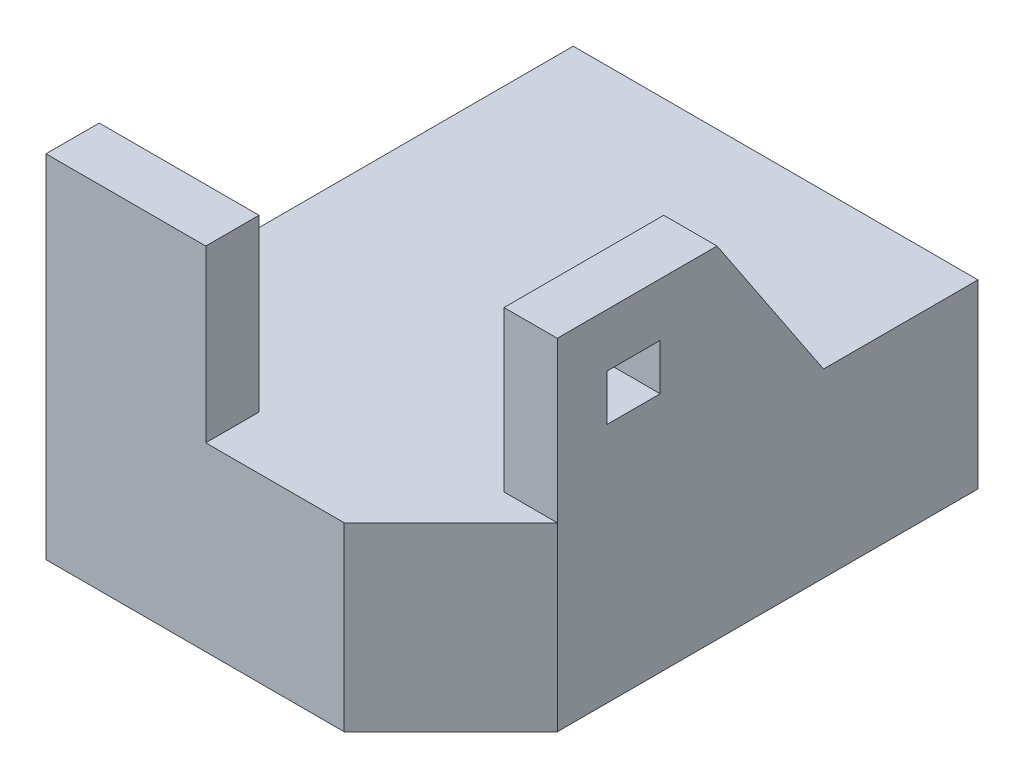
ISO-10303-21;
HEADER;
FILE_DESCRIPTION(('STEP AP214'),'2;1');
FILE_NAME('part.step','',(''),(''),'','','');
FILE_SCHEMA(('AUTOMOTIVE_DESIGN { 1 0 10303 214 1 1 1 1 }'));
ENDSEC;
DATA;
#1=APPLICATION_CONTEXT('core data for automotive mechanical design processes');
#2=APPLICATION_PROTOCOL_DEFINITION('international standard','automotive_design',2000,#1);
#3=PRODUCT_CONTEXT('',#1,'mechanical');
#4=PRODUCT('Part','Part','',(#3));
#5=PRODUCT_RELATED_PRODUCT_CATEGORY('part','',(#4));
#6=PRODUCT_DEFINITION_FORMATION('','',#4);
#7=PRODUCT_DEFINITION_CONTEXT('part definition',#1,'design');
#8=PRODUCT_DEFINITION('design','',#6,#7);
#9=PRODUCT_DEFINITION_SHAPE('','',#8);
#10=(LENGTH_UNIT() NAMED_UNIT(*) SI_UNIT(.MILLI.,.METRE.));
#11=(NAMED_UNIT(*) PLANE_ANGLE_UNIT() SI_UNIT($,.RADIAN.));
#12=(NAMED_UNIT(*) SI_UNIT($,.STERADIAN.) SOLID_ANGLE_UNIT());
#13=UNCERTAINTY_MEASURE_WITH_UNIT(LENGTH_MEASURE(1.E-05),#10,'distance_accuracy_value','');
#14=(GEOMETRIC_REPRESENTATION_CONTEXT(3) GLOBAL_UNCERTAINTY_ASSIGNED_CONTEXT((#13)) GLOBAL_UNIT_ASSIGNED_CONTEXT((#10,
#11,#12)) REPRESENTATION_CONTEXT('',''));
#15=CARTESIAN_POINT('',(0.,0.,0.));
#16=DIRECTION('',(0.,0.,1.));
#17=DIRECTION('',(1.,0.,0.));
#18=AXIS2_PLACEMENT_3D('',#15,#16,#17);
#19=CARTESIAN_POINT('',(0.,863.6,0.));
#20=DIRECTION('',(0.,-1.,0.));
#21=DIRECTION('',(0.,0.,-1.));
#22=AXIS2_PLACEMENT_3D('',#19,#20,#21);
#23=PLANE('',#22);
#24=DIRECTION('',(0.707106781186546,0.,-0.707106781186549));
#25=VECTOR('',#24,1.);
#26=CARTESIAN_POINT('',(1422.4,863.6,2514.6));
#27=LINE('',#26,#25);
#28=CARTESIAN_POINT('',(1422.4,863.6,2514.6));
#29=VERTEX_POINT('',#28);
#30=CARTESIAN_POINT('',(1930.4,863.6,2006.6));
#31=VERTEX_POINT('',#30);
#32=EDGE_CURVE('E248',#29,#31,#27,.T.);
#33=ORIENTED_EDGE('',*,*,#32,.T.);
#34=DIRECTION('',(1.,0.,0.));
#35=VECTOR('',#34,1.);
#36=CARTESIAN_POINT('',(1676.4,863.6,2006.6));
#37=LINE('',#36,#35);
#38=CARTESIAN_POINT('',(1676.4,863.6,2006.6));
#39=VERTEX_POINT('',#38);
#40=EDGE_CURVE('E204',#39,#31,#37,.T.);
#41=ORIENTED_EDGE('',*,*,#40,.F.);
#42=DIRECTION('',(0.,0.,-1.));
#43=VECTOR('',#42,1.);
#44=CARTESIAN_POINT('',(1676.4,863.6,2006.6));
#45=LINE('',#44,#43);
#46=CARTESIAN_POINT('',(1676.4,863.6,736.6));
#47=VERTEX_POINT('',#46);
#48=EDGE_CURVE('E194',#39,#47,#45,.T.);
#49=ORIENTED_EDGE('',*,*,#48,.T.);
#50=DIRECTION('',(1.,0.,0.));
#51=VECTOR('',#50,1.);
#52=CARTESIAN_POINT('',(1676.4,863.6,736.6));
#53=LINE('',#52,#51);
#54=CARTESIAN_POINT('',(1930.4,863.6,736.6));
#55=VERTEX_POINT('',#54);
#56=EDGE_CURVE('E215',#47,#55,#53,.T.);
#57=ORIENTED_EDGE('',*,*,#56,.T.);
#58=DIRECTION('',(0.,0.,1.));
#59=VECTOR('',#58,1.);
#60=CARTESIAN_POINT('',(1930.4,863.6,0.));
#61=LINE('',#60,#59);
#62=CARTESIAN_POINT('',(1930.4,863.6,0.));
#63=VERTEX_POINT('',#62);
#64=EDGE_CURVE('E244',#63,#55,#61,.T.);
#65=ORIENTED_EDGE('',*,*,#64,.F.);
#66=DIRECTION('',(1.,0.,0.));
#67=VECTOR('',#66,1.);
#68=CARTESIAN_POINT('',(0.,863.6,0.));
#69=LINE('',#68,#67);
#70=CARTESIAN_POINT('',(0.,863.6,0.));
#71=VERTEX_POINT('',#70);
#72=EDGE_CURVE('E241',#71,#63,#69,.T.);
#73=ORIENTED_EDGE('',*,*,#72,.F.);
#74=DIRECTION('',(0.,0.,1.));
#75=VECTOR('',#74,1.);
#76=CARTESIAN_POINT('',(0.,863.6,0.));
#77=LINE('',#76,#75);
#78=CARTESIAN_POINT('',(0.,863.6,2260.6));
#79=VERTEX_POINT('',#78);
#80=EDGE_CURVE('E253',#71,#79,#77,.T.);
#81=ORIENTED_EDGE('',*,*,#80,.T.);
#82=DIRECTION('',(-1.,0.,0.));
#83=VECTOR('',#82,1.);
#84=CARTESIAN_POINT('',(762.,863.6,2260.6));
#85=LINE('',#84,#83);
#86=CARTESIAN_POINT('',(762.,863.6,2260.6));
#87=VERTEX_POINT('',#86);
#88=EDGE_CURVE('E54',#87,#79,#85,.T.);
#89=ORIENTED_EDGE('',*,*,#88,.F.);
#90=DIRECTION('',(0.,0.,-1.));
#91=VECTOR('',#90,1.);
#92=CARTESIAN_POINT('',(762.,863.6,2260.6));
#93=LINE('',#92,#91);
#94=CARTESIAN_POINT('',(762.,863.6,2514.6));
#95=VERTEX_POINT('',#94);
#96=EDGE_CURVE('E59',#95,#87,#93,.T.);
#97=ORIENTED_EDGE('',*,*,#96,.F.);
#98=DIRECTION('',(1.,0.,0.));
#99=VECTOR('',#98,1.);
#100=CARTESIAN_POINT('',(0.,863.6,2514.6));
#101=LINE('',#100,#99);
#102=EDGE_CURVE('E251',#95,#29,#101,.T.);
#103=ORIENTED_EDGE('',*,*,#102,.T.);
#104=EDGE_LOOP('',(#33,#41,#49,#57,#65,#73,#81,#89,#97,#103));
#105=FACE_BOUND('',#104,.T.);
#106=ADVANCED_FACE('F37',(#105),#23,.F.);
#107=CARTESIAN_POINT('',(0.,863.6,0.));
#108=DIRECTION('',(0.,0.,-1.));
#109=DIRECTION('',(-1.,0.,0.));
#110=AXIS2_PLACEMENT_3D('',#107,#108,#109);
#111=PLANE('',#110);
#112=DIRECTION('',(1.,0.,0.));
#113=VECTOR('',#112,1.);
#114=CARTESIAN_POINT('',(0.,0.,0.));
#115=LINE('',#114,#113);
#116=CARTESIAN_POINT('',(0.,0.,0.));
#117=VERTEX_POINT('',#116);
#118=CARTESIAN_POINT('',(1930.4,0.,0.));
#119=VERTEX_POINT('',#118);
#120=EDGE_CURVE('E240',#117,#119,#115,.T.);
#121=ORIENTED_EDGE('',*,*,#120,.F.);
#122=DIRECTION('',(0.,-1.,0.));
#123=VECTOR('',#122,1.);
#124=CARTESIAN_POINT('',(0.,863.6,0.));
#125=LINE('',#124,#123);
#126=EDGE_CURVE('E11',#71,#117,#125,.T.);
#127=ORIENTED_EDGE('',*,*,#126,.F.);
#128=ORIENTED_EDGE('',*,*,#72,.T.);
#129=DIRECTION('',(0.,-1.,0.));
#130=VECTOR('',#129,1.);
#131=CARTESIAN_POINT('',(1930.4,863.6,0.));
#132=LINE('',#131,#130);
#133=EDGE_CURVE('E41',#63,#119,#132,.T.);
#134=ORIENTED_EDGE('',*,*,#133,.T.);
#135=EDGE_LOOP('',(#121,#127,#128,#134));
#136=FACE_BOUND('',#135,.T.);
#137=ADVANCED_FACE('F39',(#136),#111,.T.);
#138=CARTESIAN_POINT('',(0.,863.6,0.));
#139=DIRECTION('',(1.,0.,0.));
#140=DIRECTION('',(0.,0.,-1.));
#141=AXIS2_PLACEMENT_3D('',#138,#139,#140);
#142=PLANE('',#141);
#143=DIRECTION('',(0.,0.,1.));
#144=VECTOR('',#143,1.);
#145=CARTESIAN_POINT('',(0.,0.,0.));
#146=LINE('',#145,#144);
#147=CARTESIAN_POINT('',(0.,0.,2514.6));
#148=VERTEX_POINT('',#147);
#149=EDGE_CURVE('E245',#117,#148,#146,.T.);
#150=ORIENTED_EDGE('',*,*,#149,.T.);
#151=DIRECTION('',(0.,-1.,0.));
#152=VECTOR('',#151,1.);
#153=CARTESIAN_POINT('',(0.,863.6,2514.6));
#154=LINE('',#153,#152);
#155=CARTESIAN_POINT('',(0.,1676.4,2514.6));
#156=VERTEX_POINT('',#155);
#157=EDGE_CURVE('E46',#156,#148,#154,.T.);
#158=ORIENTED_EDGE('',*,*,#157,.F.);
#159=DIRECTION('',(0.,0.,1.));
#160=VECTOR('',#159,1.);
#161=CARTESIAN_POINT('',(0.,1676.4,2260.6));
#162=LINE('',#161,#160);
#163=CARTESIAN_POINT('',(0.,1676.4,2260.6));
#164=VERTEX_POINT('',#163);
#165=EDGE_CURVE('E225',#164,#156,#162,.T.);
#166=ORIENTED_EDGE('',*,*,#165,.F.);
#167=DIRECTION('',(0.,-1.,0.));
#168=VECTOR('',#167,1.);
#169=CARTESIAN_POINT('',(0.,1676.4,2260.6));
#170=LINE('',#169,#168);
#171=EDGE_CURVE('E235',#164,#79,#170,.T.);
#172=ORIENTED_EDGE('',*,*,#171,.T.);
#173=ORIENTED_EDGE('',*,*,#80,.F.);
#174=ORIENTED_EDGE('',*,*,#126,.T.);
#175=EDGE_LOOP('',(#150,#158,#166,#172,#173,#174));
#176=FACE_BOUND('',#175,.T.);
#177=ADVANCED_FACE('F286',(#176),#142,.F.);
#178=CARTESIAN_POINT('',(0.,863.6,2514.6));
#179=DIRECTION('',(0.,0.,-1.));
#180=DIRECTION('',(-1.,0.,0.));
#181=AXIS2_PLACEMENT_3D('',#178,#179,#180);
#182=PLANE('',#181);
#183=DIRECTION('',(1.,0.,0.));
#184=VECTOR('',#183,1.);
#185=CARTESIAN_POINT('',(0.,0.,2514.6));
#186=LINE('',#185,#184);
#187=CARTESIAN_POINT('',(1422.4,0.,2514.6));
#188=VERTEX_POINT('',#187);
#189=EDGE_CURVE('E263',#148,#188,#186,.T.);
#190=ORIENTED_EDGE('',*,*,#189,.T.);
#191=DIRECTION('',(0.,-1.,0.));
#192=VECTOR('',#191,1.);
#193=CARTESIAN_POINT('',(1422.4,863.6,2514.6));
#194=LINE('',#193,#192);
#195=EDGE_CURVE('E268',#29,#188,#194,.T.);
#196=ORIENTED_EDGE('',*,*,#195,.F.);
#197=ORIENTED_EDGE('',*,*,#102,.F.);
#198=DIRECTION('',(0.,-1.,0.));
#199=VECTOR('',#198,1.);
#200=CARTESIAN_POINT('',(762.,1676.4,2514.6));
#201=LINE('',#200,#199);
#202=CARTESIAN_POINT('',(762.,1676.4,2514.6));
#203=VERTEX_POINT('',#202);
#204=EDGE_CURVE('E230',#203,#95,#201,.T.);
#205=ORIENTED_EDGE('',*,*,#204,.F.);
#206=DIRECTION('',(1.,0.,0.));
#207=VECTOR('',#206,1.);
#208=CARTESIAN_POINT('',(762.,1676.4,2514.6));
#209=LINE('',#208,#207);
#210=EDGE_CURVE('E228',#156,#203,#209,.T.);
#211=ORIENTED_EDGE('',*,*,#210,.F.);
#212=ORIENTED_EDGE('',*,*,#157,.T.);
#213=EDGE_LOOP('',(#190,#196,#197,#205,#211,#212));
#214=FACE_BOUND('',#213,.T.);
#215=ADVANCED_FACE('F291',(#214),#182,.F.);
#216=CARTESIAN_POINT('',(1422.4,863.6,2514.6));
#217=DIRECTION('',(-0.707106781186549,0.,-0.707106781186546));
#218=DIRECTION('',(-0.707106781186546,0.,0.707106781186549));
#219=AXIS2_PLACEMENT_3D('',#216,#217,#218);
#220=PLANE('',#219);
#221=DIRECTION('',(0.707106781186546,0.,-0.707106781186549));
#222=VECTOR('',#221,1.);
#223=CARTESIAN_POINT('',(1422.4,0.,2514.6));
#224=LINE('',#223,#222);
#225=CARTESIAN_POINT('',(1930.4,0.,2006.6));
#226=VERTEX_POINT('',#225);
#227=EDGE_CURVE('E260',#188,#226,#224,.T.);
#228=ORIENTED_EDGE('',*,*,#227,.T.);
#229=DIRECTION('',(0.,-1.,0.));
#230=VECTOR('',#229,1.);
#231=CARTESIAN_POINT('',(1930.4,863.6,2006.6));
#232=LINE('',#231,#230);
#233=EDGE_CURVE('E270',#31,#226,#232,.T.);
#234=ORIENTED_EDGE('',*,*,#233,.F.);
#235=ORIENTED_EDGE('',*,*,#32,.F.);
#236=ORIENTED_EDGE('',*,*,#195,.T.);
#237=EDGE_LOOP('',(#228,#234,#235,#236));
#238=FACE_BOUND('',#237,.T.);
#239=ADVANCED_FACE('F321',(#238),#220,.F.);
#240=CARTESIAN_POINT('',(1930.4,863.6,0.));
#241=DIRECTION('',(1.,0.,0.));
#242=DIRECTION('',(0.,0.,-1.));
#243=AXIS2_PLACEMENT_3D('',#240,#241,#242);
#244=PLANE('',#243);
#245=DIRECTION('',(0.,0.,1.));
#246=VECTOR('',#245,1.);
#247=CARTESIAN_POINT('',(1930.4,0.,0.));
#248=LINE('',#247,#246);
#249=EDGE_CURVE('E257',#119,#226,#248,.T.);
#250=ORIENTED_EDGE('',*,*,#249,.F.);
#251=ORIENTED_EDGE('',*,*,#133,.F.);
#252=ORIENTED_EDGE('',*,*,#64,.T.);
#253=DIRECTION('',(0.,0.832050294337843,0.554700196225229));
#254=VECTOR('',#253,1.);
#255=CARTESIAN_POINT('',(1930.4,863.6,736.6));
#256=LINE('',#255,#254);
#257=CARTESIAN_POINT('',(1930.4,1625.6,1244.6));
#258=VERTEX_POINT('',#257);
#259=EDGE_CURVE('E206',#55,#258,#256,.T.);
#260=ORIENTED_EDGE('',*,*,#259,.T.);
#261=DIRECTION('',(0.,0.,1.));
#262=VECTOR('',#261,1.);
#263=CARTESIAN_POINT('',(1930.4,1625.6,1244.6));
#264=LINE('',#263,#262);
#265=CARTESIAN_POINT('',(1930.4,1625.6,2006.6));
#266=VERTEX_POINT('',#265);
#267=EDGE_CURVE('E195',#258,#266,#264,.T.);
#268=ORIENTED_EDGE('',*,*,#267,.T.);
#269=DIRECTION('',(0.,-1.,0.));
#270=VECTOR('',#269,1.);
#271=CARTESIAN_POINT('',(1930.4,1625.6,2006.6));
#272=LINE('',#271,#270);
#273=EDGE_CURVE('E187',#266,#31,#272,.T.);
#274=ORIENTED_EDGE('',*,*,#273,.T.);
#275=ORIENTED_EDGE('',*,*,#233,.T.);
#276=EDGE_LOOP('',(#250,#251,#252,#260,#268,#274,#275));
#277=FACE_BOUND('',#276,.T.);
#278=DIRECTION('',(0.,-1.,0.));
#279=VECTOR('',#278,1.);
#280=CARTESIAN_POINT('',(1930.4,1371.6,1769.78606773817));
#281=LINE('',#280,#279);
#282=CARTESIAN_POINT('',(1930.4,1371.6,1769.78606773817));
#283=VERTEX_POINT('',#282);
#284=CARTESIAN_POINT('',(1930.4,1150.93345170055,1769.78606773817));
#285=VERTEX_POINT('',#284);
#286=EDGE_CURVE('E154',#283,#285,#281,.T.);
#287=ORIENTED_EDGE('',*,*,#286,.F.);
#288=DIRECTION('',(0.,0.,1.));
#289=VECTOR('',#288,1.);
#290=CARTESIAN_POINT('',(1930.4,1371.6,1769.78606773817));
#291=LINE('',#290,#289);
#292=CARTESIAN_POINT('',(1930.4,1371.6,1515.78606773817));
#293=VERTEX_POINT('',#292);
#294=EDGE_CURVE('E172',#293,#283,#291,.T.);
#295=ORIENTED_EDGE('',*,*,#294,.F.);
#296=DIRECTION('',(0.,1.,0.));
#297=VECTOR('',#296,1.);
#298=CARTESIAN_POINT('',(1930.4,1371.6,1515.78606773817));
#299=LINE('',#298,#297);
#300=CARTESIAN_POINT('',(1930.4,1150.93345170055,1515.78606773817));
#301=VERTEX_POINT('',#300);
#302=EDGE_CURVE('E175',#301,#293,#299,.T.);
#303=ORIENTED_EDGE('',*,*,#302,.F.);
#304=DIRECTION('',(0.,0.,-1.));
#305=VECTOR('',#304,1.);
#306=CARTESIAN_POINT('',(1930.4,1150.93345170055,1769.78606773817));
#307=LINE('',#306,#305);
#308=EDGE_CURVE('E181',#285,#301,#307,.T.);
#309=ORIENTED_EDGE('',*,*,#308,.F.);
#310=EDGE_LOOP('',(#287,#295,#303,#309));
#311=FACE_BOUND('',#310,.T.);
#312=ADVANCED_FACE('F278',(#277,#311),#244,.T.);
#313=CARTESIAN_POINT('',(0.,0.,0.));
#314=DIRECTION('',(0.,-1.,0.));
#315=DIRECTION('',(0.,0.,-1.));
#316=AXIS2_PLACEMENT_3D('',#313,#314,#315);
#317=PLANE('',#316);
#318=ORIENTED_EDGE('',*,*,#120,.T.);
#319=ORIENTED_EDGE('',*,*,#249,.T.);
#320=ORIENTED_EDGE('',*,*,#227,.F.);
#321=ORIENTED_EDGE('',*,*,#189,.F.);
#322=ORIENTED_EDGE('',*,*,#149,.F.);
#323=EDGE_LOOP('',(#318,#319,#320,#321,#322));
#324=FACE_BOUND('',#323,.T.);
#325=ADVANCED_FACE('F283',(#324),#317,.T.);
#326=CARTESIAN_POINT('',(762.,1676.4,2260.6));
#327=DIRECTION('',(-1.,0.,0.));
#328=DIRECTION('',(0.,0.,1.));
#329=AXIS2_PLACEMENT_3D('',#326,#327,#328);
#330=PLANE('',#329);
#331=ORIENTED_EDGE('',*,*,#96,.T.);
#332=DIRECTION('',(0.,-1.,0.));
#333=VECTOR('',#332,1.);
#334=CARTESIAN_POINT('',(762.,1676.4,2260.6));
#335=LINE('',#334,#333);
#336=CARTESIAN_POINT('',(762.,1676.4,2260.6));
#337=VERTEX_POINT('',#336);
#338=EDGE_CURVE('E238',#337,#87,#335,.T.);
#339=ORIENTED_EDGE('',*,*,#338,.F.);
#340=DIRECTION('',(0.,0.,-1.));
#341=VECTOR('',#340,1.);
#342=CARTESIAN_POINT('',(762.,1676.4,2260.6));
#343=LINE('',#342,#341);
#344=EDGE_CURVE('E220',#203,#337,#343,.T.);
#345=ORIENTED_EDGE('',*,*,#344,.F.);
#346=ORIENTED_EDGE('',*,*,#204,.T.);
#347=EDGE_LOOP('',(#331,#339,#345,#346));
#348=FACE_BOUND('',#347,.T.);
#349=ADVANCED_FACE('F302',(#348),#330,.F.);
#350=CARTESIAN_POINT('',(762.,1676.4,2260.6));
#351=DIRECTION('',(0.,0.,1.));
#352=DIRECTION('',(1.,0.,0.));
#353=AXIS2_PLACEMENT_3D('',#350,#351,#352);
#354=PLANE('',#353);
#355=ORIENTED_EDGE('',*,*,#88,.T.);
#356=ORIENTED_EDGE('',*,*,#171,.F.);
#357=DIRECTION('',(-1.,0.,0.));
#358=VECTOR('',#357,1.);
#359=CARTESIAN_POINT('',(762.,1676.4,2260.6));
#360=LINE('',#359,#358);
#361=EDGE_CURVE('E223',#337,#164,#360,.T.);
#362=ORIENTED_EDGE('',*,*,#361,.F.);
#363=ORIENTED_EDGE('',*,*,#338,.T.);
#364=EDGE_LOOP('',(#355,#356,#362,#363));
#365=FACE_BOUND('',#364,.T.);
#366=ADVANCED_FACE('F300',(#365),#354,.F.);
#367=CARTESIAN_POINT('',(0.,1676.4,0.));
#368=DIRECTION('',(0.,-1.,0.));
#369=DIRECTION('',(0.,0.,-1.));
#370=AXIS2_PLACEMENT_3D('',#367,#368,#369);
#371=PLANE('',#370);
#372=ORIENTED_EDGE('',*,*,#344,.T.);
#373=ORIENTED_EDGE('',*,*,#361,.T.);
#374=ORIENTED_EDGE('',*,*,#165,.T.);
#375=ORIENTED_EDGE('',*,*,#210,.T.);
#376=EDGE_LOOP('',(#372,#373,#374,#375));
#377=FACE_BOUND('',#376,.T.);
#378=ADVANCED_FACE('F296',(#377),#371,.F.);
#379=CARTESIAN_POINT('',(1676.4,1625.6,2006.6));
#380=DIRECTION('',(0.,0.,1.));
#381=DIRECTION('',(1.,0.,0.));
#382=AXIS2_PLACEMENT_3D('',#379,#380,#381);
#383=PLANE('',#382);
#384=ORIENTED_EDGE('',*,*,#273,.F.);
#385=DIRECTION('',(1.,0.,0.));
#386=VECTOR('',#385,1.);
#387=CARTESIAN_POINT('',(1676.4,1625.6,2006.6));
#388=LINE('',#387,#386);
#389=CARTESIAN_POINT('',(1676.4,1625.6,2006.6));
#390=VERTEX_POINT('',#389);
#391=EDGE_CURVE('E211',#390,#266,#388,.T.);
#392=ORIENTED_EDGE('',*,*,#391,.F.);
#393=DIRECTION('',(0.,-1.,0.));
#394=VECTOR('',#393,1.);
#395=CARTESIAN_POINT('',(1676.4,1625.6,2006.6));
#396=LINE('',#395,#394);
#397=EDGE_CURVE('E191',#390,#39,#396,.T.);
#398=ORIENTED_EDGE('',*,*,#397,.T.);
#399=ORIENTED_EDGE('',*,*,#40,.T.);
#400=EDGE_LOOP('',(#384,#392,#398,#399));
#401=FACE_BOUND('',#400,.T.);
#402=ADVANCED_FACE('F371',(#401),#383,.T.);
#403=CARTESIAN_POINT('',(1676.4,1625.6,1244.6));
#404=DIRECTION('',(0.,1.,0.));
#405=DIRECTION('',(0.,0.,1.));
#406=AXIS2_PLACEMENT_3D('',#403,#404,#405);
#407=PLANE('',#406);
#408=ORIENTED_EDGE('',*,*,#267,.F.);
#409=DIRECTION('',(1.,0.,0.));
#410=VECTOR('',#409,1.);
#411=CARTESIAN_POINT('',(1676.4,1625.6,1244.6));
#412=LINE('',#411,#410);
#413=CARTESIAN_POINT('',(1676.4,1625.6,1244.6));
#414=VERTEX_POINT('',#413);
#415=EDGE_CURVE('E213',#414,#258,#412,.T.);
#416=ORIENTED_EDGE('',*,*,#415,.F.);
#417=DIRECTION('',(0.,0.,1.));
#418=VECTOR('',#417,1.);
#419=CARTESIAN_POINT('',(1676.4,1625.6,1244.6));
#420=LINE('',#419,#418);
#421=EDGE_CURVE('E201',#414,#390,#420,.T.);
#422=ORIENTED_EDGE('',*,*,#421,.T.);
#423=ORIENTED_EDGE('',*,*,#391,.T.);
#424=EDGE_LOOP('',(#408,#416,#422,#423));
#425=FACE_BOUND('',#424,.T.);
#426=ADVANCED_FACE('F394',(#425),#407,.T.);
#427=CARTESIAN_POINT('',(1676.4,863.6,736.6));
#428=DIRECTION('',(0.,0.554700196225229,-0.832050294337844));
#429=DIRECTION('',(0.,0.832050294337844,0.554700196225229));
#430=AXIS2_PLACEMENT_3D('',#427,#428,#429);
#431=PLANE('',#430);
#432=ORIENTED_EDGE('',*,*,#259,.F.);
#433=ORIENTED_EDGE('',*,*,#56,.F.);
#434=DIRECTION('',(0.,0.832050294337843,0.554700196225229));
#435=VECTOR('',#434,1.);
#436=CARTESIAN_POINT('',(1676.4,863.6,736.6));
#437=LINE('',#436,#435);
#438=EDGE_CURVE('E198',#47,#414,#437,.T.);
#439=ORIENTED_EDGE('',*,*,#438,.T.);
#440=ORIENTED_EDGE('',*,*,#415,.T.);
#441=EDGE_LOOP('',(#432,#433,#439,#440));
#442=FACE_BOUND('',#441,.T.);
#443=ADVANCED_FACE('F403',(#442),#431,.T.);
#444=CARTESIAN_POINT('',(1676.4,0.,-2.81293975454394E-13));
#445=DIRECTION('',(1.,0.,0.));
#446=DIRECTION('',(0.,0.,-1.));
#447=AXIS2_PLACEMENT_3D('',#444,#445,#446);
#448=PLANE('',#447);
#449=DIRECTION('',(0.,0.,1.));
#450=VECTOR('',#449,1.);
#451=CARTESIAN_POINT('',(1676.4,1371.6,1769.78606773817));
#452=LINE('',#451,#450);
#453=CARTESIAN_POINT('',(1676.4,1371.6,1515.78606773817));
#454=VERTEX_POINT('',#453);
#455=CARTESIAN_POINT('',(1676.4,1371.6,1769.78606773817));
#456=VERTEX_POINT('',#455);
#457=EDGE_CURVE('E159',#454,#456,#452,.T.);
#458=ORIENTED_EDGE('',*,*,#457,.T.);
#459=DIRECTION('',(0.,-1.,0.));
#460=VECTOR('',#459,1.);
#461=CARTESIAN_POINT('',(1676.4,1371.6,1769.78606773817));
#462=LINE('',#461,#460);
#463=CARTESIAN_POINT('',(1676.4,1150.93345170055,1769.78606773817));
#464=VERTEX_POINT('',#463);
#465=EDGE_CURVE('E151',#456,#464,#462,.T.);
#466=ORIENTED_EDGE('',*,*,#465,.T.);
#467=DIRECTION('',(0.,0.,-1.));
#468=VECTOR('',#467,1.);
#469=CARTESIAN_POINT('',(1676.4,1150.93345170055,1769.78606773817));
#470=LINE('',#469,#468);
#471=CARTESIAN_POINT('',(1676.4,1150.93345170055,1515.78606773817));
#472=VERTEX_POINT('',#471);
#473=EDGE_CURVE('E163',#464,#472,#470,.T.);
#474=ORIENTED_EDGE('',*,*,#473,.T.);
#475=DIRECTION('',(0.,1.,0.));
#476=VECTOR('',#475,1.);
#477=CARTESIAN_POINT('',(1676.4,1371.6,1515.78606773817));
#478=LINE('',#477,#476);
#479=EDGE_CURVE('E167',#472,#454,#478,.T.);
#480=ORIENTED_EDGE('',*,*,#479,.T.);
#481=EDGE_LOOP('',(#458,#466,#474,#480));
#482=FACE_BOUND('',#481,.T.);
#483=ORIENTED_EDGE('',*,*,#397,.F.);
#484=ORIENTED_EDGE('',*,*,#421,.F.);
#485=ORIENTED_EDGE('',*,*,#438,.F.);
#486=ORIENTED_EDGE('',*,*,#48,.F.);
#487=EDGE_LOOP('',(#483,#484,#485,#486));
#488=FACE_BOUND('',#487,.T.);
#489=ADVANCED_FACE('F169',(#482,#488),#448,.F.);
#490=CARTESIAN_POINT('',(1676.4,1371.6,1769.78606773817));
#491=DIRECTION('',(0.,0.,1.));
#492=DIRECTION('',(1.,0.,0.));
#493=AXIS2_PLACEMENT_3D('',#490,#491,#492);
#494=PLANE('',#493);
#495=ORIENTED_EDGE('',*,*,#286,.T.);
#496=DIRECTION('',(1.,0.,0.));
#497=VECTOR('',#496,1.);
#498=CARTESIAN_POINT('',(1676.4,1150.93345170055,1769.78606773817));
#499=LINE('',#498,#497);
#500=EDGE_CURVE('E147',#464,#285,#499,.T.);
#501=ORIENTED_EDGE('',*,*,#500,.F.);
#502=ORIENTED_EDGE('',*,*,#465,.F.);
#503=DIRECTION('',(1.,0.,0.));
#504=VECTOR('',#503,1.);
#505=CARTESIAN_POINT('',(1676.4,1371.6,1769.78606773817));
#506=LINE('',#505,#504);
#507=EDGE_CURVE('E185',#456,#283,#506,.T.);
#508=ORIENTED_EDGE('',*,*,#507,.T.);
#509=EDGE_LOOP('',(#495,#501,#502,#508));
#510=FACE_BOUND('',#509,.T.);
#511=ADVANCED_FACE('F149',(#510),#494,.F.);
#512=CARTESIAN_POINT('',(1676.4,1371.6,1769.78606773817));
#513=DIRECTION('',(0.,1.,0.));
#514=DIRECTION('',(0.,0.,1.));
#515=AXIS2_PLACEMENT_3D('',#512,#513,#514);
#516=PLANE('',#515);
#517=ORIENTED_EDGE('',*,*,#294,.T.);
#518=ORIENTED_EDGE('',*,*,#507,.F.);
#519=ORIENTED_EDGE('',*,*,#457,.F.);
#520=DIRECTION('',(1.,0.,0.));
#521=VECTOR('',#520,1.);
#522=CARTESIAN_POINT('',(1676.4,1371.6,1515.78606773817));
#523=LINE('',#522,#521);
#524=EDGE_CURVE('E188',#454,#293,#523,.T.);
#525=ORIENTED_EDGE('',*,*,#524,.T.);
#526=EDGE_LOOP('',(#517,#518,#519,#525));
#527=FACE_BOUND('',#526,.T.);
#528=ADVANCED_FACE('F427',(#527),#516,.F.);
#529=CARTESIAN_POINT('',(1676.4,1371.6,1515.78606773817));
#530=DIRECTION('',(0.,0.,-1.));
#531=DIRECTION('',(-1.,0.,0.));
#532=AXIS2_PLACEMENT_3D('',#529,#530,#531);
#533=PLANE('',#532);
#534=ORIENTED_EDGE('',*,*,#302,.T.);
#535=ORIENTED_EDGE('',*,*,#524,.F.);
#536=ORIENTED_EDGE('',*,*,#479,.F.);
#537=DIRECTION('',(1.,0.,0.));
#538=VECTOR('',#537,1.);
#539=CARTESIAN_POINT('',(1676.4,1150.93345170055,1515.78606773817));
#540=LINE('',#539,#538);
#541=EDGE_CURVE('E158',#472,#301,#540,.T.);
#542=ORIENTED_EDGE('',*,*,#541,.T.);
#543=EDGE_LOOP('',(#534,#535,#536,#542));
#544=FACE_BOUND('',#543,.T.);
#545=ADVANCED_FACE('F435',(#544),#533,.F.);
#546=CARTESIAN_POINT('',(1676.4,1150.93345170055,1769.78606773817));
#547=DIRECTION('',(0.,-1.,0.));
#548=DIRECTION('',(0.,0.,-1.));
#549=AXIS2_PLACEMENT_3D('',#546,#547,#548);
#550=PLANE('',#549);
#551=ORIENTED_EDGE('',*,*,#308,.T.);
#552=ORIENTED_EDGE('',*,*,#541,.F.);
#553=ORIENTED_EDGE('',*,*,#473,.F.);
#554=ORIENTED_EDGE('',*,*,#500,.T.);
#555=EDGE_LOOP('',(#551,#552,#553,#554));
#556=FACE_BOUND('',#555,.T.);
#557=ADVANCED_FACE('F164',(#556),#550,.F.);
#558=CLOSED_SHELL('',(#106,#137,#177,#215,#239,#312,#325,#349,#366,#378,#402,#426,#443,#489,
#511,#528,#545,#557));
#559=MANIFOLD_SOLID_BREP('B2',#558);
#560=ADVANCED_BREP_SHAPE_REPRESENTATION('',(#18,#559),#14);
#561=SHAPE_DEFINITION_REPRESENTATION(#9,#560);
ENDSEC;
END-ISO-10303-21;
